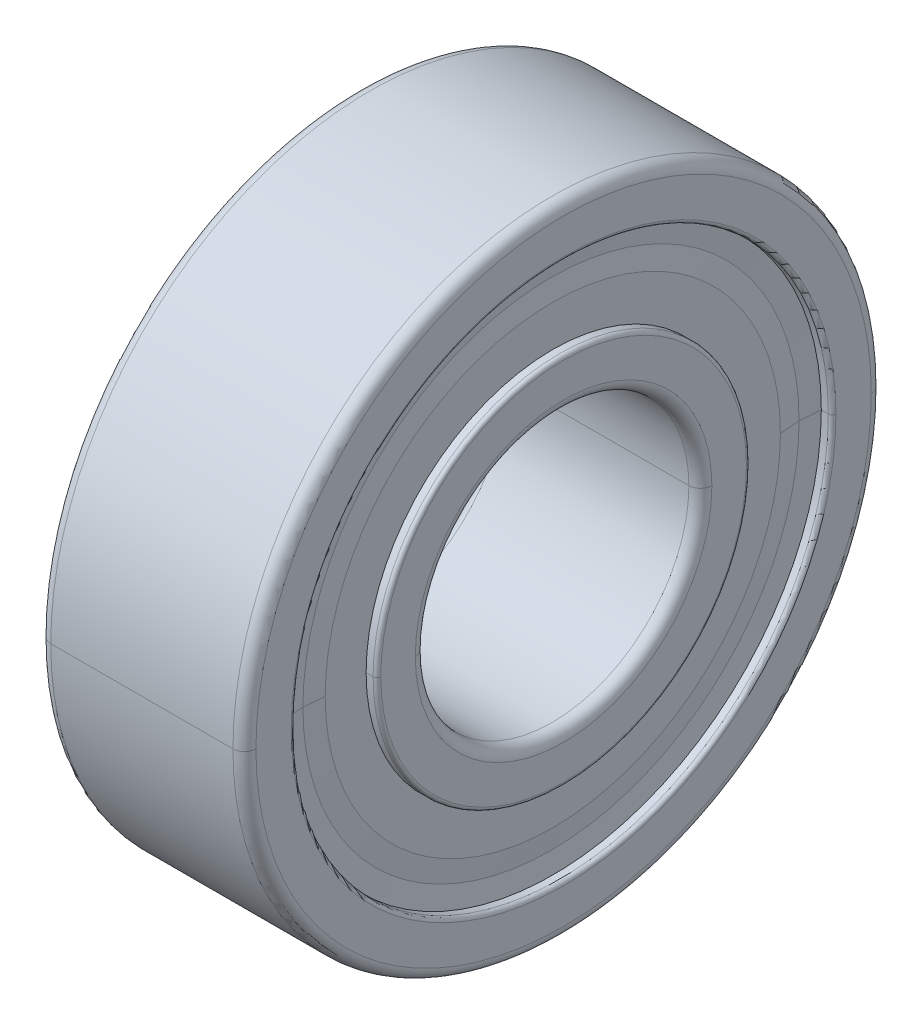
ISO-10303-21;
HEADER;
FILE_DESCRIPTION(('STEP AP214'),'2;1');
FILE_NAME('part.step','',(''),(''),'','','');
FILE_SCHEMA(('AUTOMOTIVE_DESIGN { 1 0 10303 214 1 1 1 1 }'));
ENDSEC;
DATA;
#1=APPLICATION_CONTEXT('core data for automotive mechanical design processes');
#2=APPLICATION_PROTOCOL_DEFINITION('international standard','automotive_design',2000,#1);
#3=PRODUCT_CONTEXT('',#1,'mechanical');
#4=PRODUCT('Part','Part','',(#3));
#5=PRODUCT_RELATED_PRODUCT_CATEGORY('part','',(#4));
#6=PRODUCT_DEFINITION_FORMATION('','',#4);
#7=PRODUCT_DEFINITION_CONTEXT('part definition',#1,'design');
#8=PRODUCT_DEFINITION('design','',#6,#7);
#9=PRODUCT_DEFINITION_SHAPE('','',#8);
#10=(LENGTH_UNIT() NAMED_UNIT(*) SI_UNIT(.MILLI.,.METRE.));
#11=(NAMED_UNIT(*) PLANE_ANGLE_UNIT() SI_UNIT($,.RADIAN.));
#12=(NAMED_UNIT(*) SI_UNIT($,.STERADIAN.) SOLID_ANGLE_UNIT());
#13=UNCERTAINTY_MEASURE_WITH_UNIT(LENGTH_MEASURE(1.E-05),#10,'distance_accuracy_value','');
#14=(GEOMETRIC_REPRESENTATION_CONTEXT(3) GLOBAL_UNCERTAINTY_ASSIGNED_CONTEXT((#13)) GLOBAL_UNIT_ASSIGNED_CONTEXT((#10,
#11,#12)) REPRESENTATION_CONTEXT('',''));
#15=CARTESIAN_POINT('',(0.,0.,0.));
#16=DIRECTION('',(0.,0.,1.));
#17=DIRECTION('',(1.,0.,0.));
#18=AXIS2_PLACEMENT_3D('',#15,#16,#17);
#19=CARTESIAN_POINT('',(-14.5369143589278,0.,0.));
#20=DIRECTION('',(-1.,0.,0.));
#21=DIRECTION('',(0.,0.,1.));
#22=AXIS2_PLACEMENT_3D('',#19,#20,#21);
#23=CYLINDRICAL_SURFACE('',#22,4.763);
#24=DIRECTION('',(-1.,0.,0.));
#25=VECTOR('',#24,1.);
#26=CARTESIAN_POINT('',(-14.5369143589278,0.,-4.763));
#27=LINE('',#26,#25);
#28=CARTESIAN_POINT('',(6.744,0.,-4.763));
#29=VERTEX_POINT('',#28);
#30=CARTESIAN_POINT('',(0.4,0.,-4.763));
#31=VERTEX_POINT('',#30);
#32=EDGE_CURVE('E257',#29,#31,#27,.T.);
#33=ORIENTED_EDGE('',*,*,#32,.F.);
#34=CARTESIAN_POINT('',(6.744,0.,0.));
#35=DIRECTION('',(-1.,0.,0.));
#36=DIRECTION('',(0.,0.,1.));
#37=AXIS2_PLACEMENT_3D('',#34,#35,#36);
#38=CIRCLE('',#37,4.763);
#39=CARTESIAN_POINT('',(6.744,0.,4.763));
#40=VERTEX_POINT('',#39);
#41=EDGE_CURVE('E244',#40,#29,#38,.T.);
#42=ORIENTED_EDGE('',*,*,#41,.F.);
#43=DIRECTION('',(-1.,0.,0.));
#44=VECTOR('',#43,1.);
#45=CARTESIAN_POINT('',(-14.5369143589278,0.,4.763));
#46=LINE('',#45,#44);
#47=CARTESIAN_POINT('',(0.4,0.,4.763));
#48=VERTEX_POINT('',#47);
#49=EDGE_CURVE('E254',#40,#48,#46,.T.);
#50=ORIENTED_EDGE('',*,*,#49,.T.);
#51=CARTESIAN_POINT('',(0.4,0.,0.));
#52=DIRECTION('',(-1.,0.,0.));
#53=DIRECTION('',(0.,0.,1.));
#54=AXIS2_PLACEMENT_3D('',#51,#52,#53);
#55=CIRCLE('',#54,4.763);
#56=EDGE_CURVE('E259',#48,#31,#55,.T.);
#57=ORIENTED_EDGE('',*,*,#56,.T.);
#58=EDGE_LOOP('',(#33,#42,#50,#57));
#59=FACE_BOUND('',#58,.T.);
#60=ADVANCED_FACE('F15',(#59),#23,.F.);
#61=CARTESIAN_POINT('',(6.744,0.,0.));
#62=DIRECTION('',(-1.,0.,0.));
#63=DIRECTION('',(0.,0.,1.));
#64=AXIS2_PLACEMENT_3D('',#61,#62,#63);
#65=TOROIDAL_SURFACE('',#64,5.16300000000007,0.400000000000066);
#66=CARTESIAN_POINT('',(6.744,0.,-5.16300000000007));
#67=DIRECTION('',(0.,1.,0.));
#68=DIRECTION('',(0.,0.,1.));
#69=AXIS2_PLACEMENT_3D('',#66,#67,#68);
#70=CIRCLE('',#69,0.400000000000066);
#71=CARTESIAN_POINT('',(7.144,0.,-5.163));
#72=VERTEX_POINT('',#71);
#73=EDGE_CURVE('E233',#29,#72,#70,.T.);
#74=ORIENTED_EDGE('',*,*,#73,.F.);
#75=CARTESIAN_POINT('',(6.744,0.,0.));
#76=DIRECTION('',(-1.,0.,0.));
#77=DIRECTION('',(0.,0.,1.));
#78=AXIS2_PLACEMENT_3D('',#75,#76,#77);
#79=CIRCLE('',#78,4.763);
#80=EDGE_CURVE('E238',#29,#40,#79,.T.);
#81=ORIENTED_EDGE('',*,*,#80,.T.);
#82=CARTESIAN_POINT('',(6.744,0.,5.16300000000007));
#83=DIRECTION('',(0.,-1.,0.));
#84=DIRECTION('',(0.,0.,-1.));
#85=AXIS2_PLACEMENT_3D('',#82,#83,#84);
#86=CIRCLE('',#85,0.400000000000066);
#87=CARTESIAN_POINT('',(7.144,0.,5.163));
#88=VERTEX_POINT('',#87);
#89=EDGE_CURVE('E249',#40,#88,#86,.T.);
#90=ORIENTED_EDGE('',*,*,#89,.T.);
#91=CARTESIAN_POINT('',(7.144,0.,0.));
#92=DIRECTION('',(-1.,0.,0.));
#93=DIRECTION('',(0.,0.,1.));
#94=AXIS2_PLACEMENT_3D('',#91,#92,#93);
#95=CIRCLE('',#94,5.163);
#96=EDGE_CURVE('E10',#72,#88,#95,.T.);
#97=ORIENTED_EDGE('',*,*,#96,.F.);
#98=EDGE_LOOP('',(#74,#81,#90,#97));
#99=FACE_BOUND('',#98,.T.);
#100=ADVANCED_FACE('F235',(#99),#65,.T.);
#101=CARTESIAN_POINT('',(7.144,-6.367,0.));
#102=DIRECTION('',(1.,0.,0.));
#103=DIRECTION('',(0.,1.,0.));
#104=AXIS2_PLACEMENT_3D('',#101,#102,#103);
#105=PLANE('',#104);
#106=CARTESIAN_POINT('',(7.144,0.,0.));
#107=DIRECTION('',(-1.,0.,0.));
#108=DIRECTION('',(0.,0.,1.));
#109=AXIS2_PLACEMENT_3D('',#106,#107,#108);
#110=CIRCLE('',#109,5.163);
#111=EDGE_CURVE('E243',#88,#72,#110,.T.);
#112=ORIENTED_EDGE('',*,*,#111,.T.);
#113=ORIENTED_EDGE('',*,*,#96,.T.);
#114=EDGE_LOOP('',(#112,#113));
#115=FACE_BOUND('',#114,.T.);
#116=CARTESIAN_POINT('',(7.144,0.,0.));
#117=DIRECTION('',(-1.,0.,0.));
#118=DIRECTION('',(0.,0.,1.));
#119=AXIS2_PLACEMENT_3D('',#116,#117,#118);
#120=CIRCLE('',#119,6.367);
#121=CARTESIAN_POINT('',(7.144,0.,6.367));
#122=VERTEX_POINT('',#121);
#123=CARTESIAN_POINT('',(7.144,0.,-6.367));
#124=VERTEX_POINT('',#123);
#125=EDGE_CURVE('E393',#122,#124,#120,.T.);
#126=ORIENTED_EDGE('',*,*,#125,.F.);
#127=CARTESIAN_POINT('',(7.144,0.,0.));
#128=DIRECTION('',(-1.,0.,0.));
#129=DIRECTION('',(0.,0.,1.));
#130=AXIS2_PLACEMENT_3D('',#127,#128,#129);
#131=CIRCLE('',#130,6.367);
#132=EDGE_CURVE('E26',#124,#122,#131,.T.);
#133=ORIENTED_EDGE('',*,*,#132,.F.);
#134=EDGE_LOOP('',(#126,#133));
#135=FACE_BOUND('',#134,.T.);
#136=ADVANCED_FACE('F840',(#115,#135),#105,.T.);
#137=CARTESIAN_POINT('',(7.011,0.,0.));
#138=DIRECTION('',(-1.,0.,0.));
#139=DIRECTION('',(0.,0.,1.));
#140=AXIS2_PLACEMENT_3D('',#137,#138,#139);
#141=TOROIDAL_SURFACE('',#140,6.367,0.133000000000035);
#142=CARTESIAN_POINT('',(7.011,0.,-6.367));
#143=DIRECTION('',(0.,1.,0.));
#144=DIRECTION('',(0.,0.,1.));
#145=AXIS2_PLACEMENT_3D('',#142,#143,#144);
#146=CIRCLE('',#145,0.133000000000036);
#147=CARTESIAN_POINT('',(7.011,0.,-6.5));
#148=VERTEX_POINT('',#147);
#149=EDGE_CURVE('E397',#124,#148,#146,.T.);
#150=ORIENTED_EDGE('',*,*,#149,.F.);
#151=ORIENTED_EDGE('',*,*,#132,.T.);
#152=CARTESIAN_POINT('',(7.011,0.,6.367));
#153=DIRECTION('',(0.,-1.,0.));
#154=DIRECTION('',(0.,0.,-1.));
#155=AXIS2_PLACEMENT_3D('',#152,#153,#154);
#156=CIRCLE('',#155,0.133000000000036);
#157=CARTESIAN_POINT('',(7.011,0.,6.5));
#158=VERTEX_POINT('',#157);
#159=EDGE_CURVE('E489',#122,#158,#156,.T.);
#160=ORIENTED_EDGE('',*,*,#159,.T.);
#161=CARTESIAN_POINT('',(7.011,0.,0.));
#162=DIRECTION('',(-1.,0.,0.));
#163=DIRECTION('',(0.,0.,1.));
#164=AXIS2_PLACEMENT_3D('',#161,#162,#163);
#165=CIRCLE('',#164,6.5);
#166=EDGE_CURVE('E441',#148,#158,#165,.T.);
#167=ORIENTED_EDGE('',*,*,#166,.F.);
#168=EDGE_LOOP('',(#150,#151,#160,#167));
#169=FACE_BOUND('',#168,.T.);
#170=ADVANCED_FACE('F756',(#169),#141,.T.);
#171=CARTESIAN_POINT('',(-14.5369143589278,0.,0.));
#172=DIRECTION('',(-1.,0.,0.));
#173=DIRECTION('',(0.,0.,1.));
#174=AXIS2_PLACEMENT_3D('',#171,#172,#173);
#175=CYLINDRICAL_SURFACE('',#174,6.5);
#176=DIRECTION('',(-1.,0.,0.));
#177=VECTOR('',#176,1.);
#178=CARTESIAN_POINT('',(-14.5369143589278,0.,-6.5));
#179=LINE('',#178,#177);
#180=CARTESIAN_POINT('',(6.768,0.,-6.5));
#181=VERTEX_POINT('',#180);
#182=EDGE_CURVE('E291',#148,#181,#179,.T.);
#183=ORIENTED_EDGE('',*,*,#182,.F.);
#184=ORIENTED_EDGE('',*,*,#166,.T.);
#185=DIRECTION('',(-1.,0.,0.));
#186=VECTOR('',#185,1.);
#187=CARTESIAN_POINT('',(-14.5369143589278,0.,6.5));
#188=LINE('',#187,#186);
#189=CARTESIAN_POINT('',(6.768,0.,6.5));
#190=VERTEX_POINT('',#189);
#191=EDGE_CURVE('E290',#158,#190,#188,.T.);
#192=ORIENTED_EDGE('',*,*,#191,.T.);
#193=CARTESIAN_POINT('',(6.768,0.,0.));
#194=DIRECTION('',(-1.,0.,0.));
#195=DIRECTION('',(0.,0.,1.));
#196=AXIS2_PLACEMENT_3D('',#193,#194,#195);
#197=CIRCLE('',#196,6.5);
#198=EDGE_CURVE('E466',#181,#190,#197,.T.);
#199=ORIENTED_EDGE('',*,*,#198,.F.);
#200=EDGE_LOOP('',(#183,#184,#192,#199));
#201=FACE_BOUND('',#200,.T.);
#202=ADVANCED_FACE('F726',(#201),#175,.T.);
#203=CARTESIAN_POINT('',(6.768,-7.925,0.));
#204=DIRECTION('',(1.,0.,0.));
#205=DIRECTION('',(0.,1.,0.));
#206=AXIS2_PLACEMENT_3D('',#203,#204,#205);
#207=PLANE('',#206);
#208=CARTESIAN_POINT('',(6.768,0.,0.));
#209=DIRECTION('',(-1.,0.,0.));
#210=DIRECTION('',(0.,0.,1.));
#211=AXIS2_PLACEMENT_3D('',#208,#209,#210);
#212=CIRCLE('',#211,6.5);
#213=EDGE_CURVE('E286',#190,#181,#212,.T.);
#214=ORIENTED_EDGE('',*,*,#213,.T.);
#215=ORIENTED_EDGE('',*,*,#198,.T.);
#216=EDGE_LOOP('',(#214,#215));
#217=FACE_BOUND('',#216,.T.);
#218=CARTESIAN_POINT('',(6.768,0.,0.));
#219=DIRECTION('',(-1.,0.,0.));
#220=DIRECTION('',(0.,0.,1.));
#221=AXIS2_PLACEMENT_3D('',#218,#219,#220);
#222=CIRCLE('',#221,7.925);
#223=CARTESIAN_POINT('',(6.768,0.,7.925));
#224=VERTEX_POINT('',#223);
#225=CARTESIAN_POINT('',(6.768,0.,-7.925));
#226=VERTEX_POINT('',#225);
#227=EDGE_CURVE('E325',#224,#226,#222,.T.);
#228=ORIENTED_EDGE('',*,*,#227,.F.);
#229=CARTESIAN_POINT('',(6.768,0.,0.));
#230=DIRECTION('',(-1.,0.,0.));
#231=DIRECTION('',(0.,0.,1.));
#232=AXIS2_PLACEMENT_3D('',#229,#230,#231);
#233=CIRCLE('',#232,7.925);
#234=EDGE_CURVE('E19',#226,#224,#233,.T.);
#235=ORIENTED_EDGE('',*,*,#234,.F.);
#236=EDGE_LOOP('',(#228,#235));
#237=FACE_BOUND('',#236,.T.);
#238=ADVANCED_FACE('F721',(#217,#237),#207,.T.);
#239=CARTESIAN_POINT('',(6.70525,0.,0.));
#240=DIRECTION('',(-1.,0.,0.));
#241=DIRECTION('',(0.,0.,1.));
#242=AXIS2_PLACEMENT_3D('',#239,#240,#241);
#243=CONICAL_SURFACE('',#242,8.6375,1.48295279871847);
#244=DIRECTION('',(-0.0877305977724769,0.,-0.996144237655614));
#245=VECTOR('',#244,1.);
#246=CARTESIAN_POINT('',(6.70525,0.,-8.6375));
#247=LINE('',#246,#245);
#248=CARTESIAN_POINT('',(6.70525,0.,-8.6375));
#249=VERTEX_POINT('',#248);
#250=EDGE_CURVE('E329',#226,#249,#247,.T.);
#251=ORIENTED_EDGE('',*,*,#250,.F.);
#252=ORIENTED_EDGE('',*,*,#234,.T.);
#253=DIRECTION('',(-0.0877305977724769,0.,0.996144237655614));
#254=VECTOR('',#253,1.);
#255=CARTESIAN_POINT('',(6.70525,0.,8.6375));
#256=LINE('',#255,#254);
#257=CARTESIAN_POINT('',(6.70525,0.,8.6375));
#258=VERTEX_POINT('',#257);
#259=EDGE_CURVE('E308',#224,#258,#256,.T.);
#260=ORIENTED_EDGE('',*,*,#259,.T.);
#261=CARTESIAN_POINT('',(6.70525,0.,0.));
#262=DIRECTION('',(-1.,0.,0.));
#263=DIRECTION('',(0.,0.,1.));
#264=AXIS2_PLACEMENT_3D('',#261,#262,#263);
#265=CIRCLE('',#264,8.6375);
#266=EDGE_CURVE('E312',#249,#258,#265,.T.);
#267=ORIENTED_EDGE('',*,*,#266,.F.);
#268=EDGE_LOOP('',(#251,#252,#260,#267));
#269=FACE_BOUND('',#268,.T.);
#270=ADVANCED_FACE('F725',(#269),#243,.T.);
#271=CARTESIAN_POINT('',(6.768,0.,0.));
#272=DIRECTION('',(1.,0.,0.));
#273=DIRECTION('',(0.,0.,-1.));
#274=AXIS2_PLACEMENT_3D('',#271,#272,#273);
#275=CONICAL_SURFACE('',#274,9.35,1.48295279871847);
#276=DIRECTION('',(0.0877305977724773,0.,0.996144237655614));
#277=VECTOR('',#276,1.);
#278=CARTESIAN_POINT('',(6.768,0.,9.35));
#279=LINE('',#278,#277);
#280=CARTESIAN_POINT('',(6.768,0.,9.35));
#281=VERTEX_POINT('',#280);
#282=EDGE_CURVE('E374',#258,#281,#279,.T.);
#283=ORIENTED_EDGE('',*,*,#282,.F.);
#284=CARTESIAN_POINT('',(6.70525,0.,0.));
#285=DIRECTION('',(-1.,0.,0.));
#286=DIRECTION('',(0.,0.,1.));
#287=AXIS2_PLACEMENT_3D('',#284,#285,#286);
#288=CIRCLE('',#287,8.6375);
#289=EDGE_CURVE('E313',#258,#249,#288,.T.);
#290=ORIENTED_EDGE('',*,*,#289,.T.);
#291=DIRECTION('',(0.0877305977724773,0.,-0.996144237655614));
#292=VECTOR('',#291,1.);
#293=CARTESIAN_POINT('',(6.768,0.,-9.35));
#294=LINE('',#293,#292);
#295=CARTESIAN_POINT('',(6.768,0.,-9.35));
#296=VERTEX_POINT('',#295);
#297=EDGE_CURVE('E373',#249,#296,#294,.T.);
#298=ORIENTED_EDGE('',*,*,#297,.T.);
#299=CARTESIAN_POINT('',(6.768,0.,0.));
#300=DIRECTION('',(-1.,0.,0.));
#301=DIRECTION('',(0.,0.,1.));
#302=AXIS2_PLACEMENT_3D('',#299,#300,#301);
#303=CIRCLE('',#302,9.35);
#304=EDGE_CURVE('E423',#281,#296,#303,.T.);
#305=ORIENTED_EDGE('',*,*,#304,.F.);
#306=EDGE_LOOP('',(#283,#290,#298,#305));
#307=FACE_BOUND('',#306,.T.);
#308=ADVANCED_FACE('F696',(#307),#275,.F.);
#309=CARTESIAN_POINT('',(-14.5369143589278,0.,0.));
#310=DIRECTION('',(-1.,0.,0.));
#311=DIRECTION('',(0.,0.,1.));
#312=AXIS2_PLACEMENT_3D('',#309,#310,#311);
#313=CYLINDRICAL_SURFACE('',#312,9.35);
#314=DIRECTION('',(-1.,0.,0.));
#315=VECTOR('',#314,1.);
#316=CARTESIAN_POINT('',(-14.5369143589278,0.,-9.35));
#317=LINE('',#316,#315);
#318=CARTESIAN_POINT('',(7.011,0.,-9.35));
#319=VERTEX_POINT('',#318);
#320=EDGE_CURVE('E307',#319,#296,#317,.T.);
#321=ORIENTED_EDGE('',*,*,#320,.F.);
#322=CARTESIAN_POINT('',(7.011,0.,0.));
#323=DIRECTION('',(-1.,0.,0.));
#324=DIRECTION('',(0.,0.,1.));
#325=AXIS2_PLACEMENT_3D('',#322,#323,#324);
#326=CIRCLE('',#325,9.35);
#327=CARTESIAN_POINT('',(7.011,0.,9.35));
#328=VERTEX_POINT('',#327);
#329=EDGE_CURVE('E306',#328,#319,#326,.T.);
#330=ORIENTED_EDGE('',*,*,#329,.F.);
#331=DIRECTION('',(-1.,0.,0.));
#332=VECTOR('',#331,1.);
#333=CARTESIAN_POINT('',(-14.5369143589278,0.,9.35));
#334=LINE('',#333,#332);
#335=EDGE_CURVE('E302',#328,#281,#334,.T.);
#336=ORIENTED_EDGE('',*,*,#335,.T.);
#337=ORIENTED_EDGE('',*,*,#304,.T.);
#338=EDGE_LOOP('',(#321,#330,#336,#337));
#339=FACE_BOUND('',#338,.T.);
#340=ADVANCED_FACE('F691',(#339),#313,.F.);
#341=CARTESIAN_POINT('',(7.011,0.,0.));
#342=DIRECTION('',(-1.,0.,0.));
#343=DIRECTION('',(0.,0.,1.));
#344=AXIS2_PLACEMENT_3D('',#341,#342,#343);
#345=TOROIDAL_SURFACE('',#344,9.483,0.133000000000035);
#346=CARTESIAN_POINT('',(7.011,0.,-9.483));
#347=DIRECTION('',(0.,1.,0.));
#348=DIRECTION('',(0.,0.,1.));
#349=AXIS2_PLACEMENT_3D('',#346,#347,#348);
#350=CIRCLE('',#349,0.133000000000036);
#351=CARTESIAN_POINT('',(7.144,0.,-9.483));
#352=VERTEX_POINT('',#351);
#353=EDGE_CURVE('E385',#319,#352,#350,.T.);
#354=ORIENTED_EDGE('',*,*,#353,.F.);
#355=CARTESIAN_POINT('',(7.011,0.,0.));
#356=DIRECTION('',(-1.,0.,0.));
#357=DIRECTION('',(0.,0.,1.));
#358=AXIS2_PLACEMENT_3D('',#355,#356,#357);
#359=CIRCLE('',#358,9.35);
#360=EDGE_CURVE('E442',#319,#328,#359,.T.);
#361=ORIENTED_EDGE('',*,*,#360,.T.);
#362=CARTESIAN_POINT('',(7.011,0.,9.483));
#363=DIRECTION('',(0.,-1.,0.));
#364=DIRECTION('',(0.,0.,-1.));
#365=AXIS2_PLACEMENT_3D('',#362,#363,#364);
#366=CIRCLE('',#365,0.133000000000036);
#367=CARTESIAN_POINT('',(7.144,0.,9.483));
#368=VERTEX_POINT('',#367);
#369=EDGE_CURVE('E342',#328,#368,#366,.T.);
#370=ORIENTED_EDGE('',*,*,#369,.T.);
#371=CARTESIAN_POINT('',(7.144,0.,0.));
#372=DIRECTION('',(-1.,0.,0.));
#373=DIRECTION('',(0.,0.,1.));
#374=AXIS2_PLACEMENT_3D('',#371,#372,#373);
#375=CIRCLE('',#374,9.483);
#376=EDGE_CURVE('E294',#352,#368,#375,.T.);
#377=ORIENTED_EDGE('',*,*,#376,.F.);
#378=EDGE_LOOP('',(#354,#361,#370,#377));
#379=FACE_BOUND('',#378,.T.);
#380=ADVANCED_FACE('F695',(#379),#345,.T.);
#381=CARTESIAN_POINT('',(7.144,-10.713,0.));
#382=DIRECTION('',(1.,0.,0.));
#383=DIRECTION('',(0.,1.,0.));
#384=AXIS2_PLACEMENT_3D('',#381,#382,#383);
#385=PLANE('',#384);
#386=CARTESIAN_POINT('',(7.144,0.,0.));
#387=DIRECTION('',(-1.,0.,0.));
#388=DIRECTION('',(0.,0.,1.));
#389=AXIS2_PLACEMENT_3D('',#386,#387,#388);
#390=CIRCLE('',#389,9.483);
#391=EDGE_CURVE('E449',#368,#352,#390,.T.);
#392=ORIENTED_EDGE('',*,*,#391,.T.);
#393=ORIENTED_EDGE('',*,*,#376,.T.);
#394=EDGE_LOOP('',(#392,#393));
#395=FACE_BOUND('',#394,.T.);
#396=CARTESIAN_POINT('',(7.144,0.,0.));
#397=DIRECTION('',(-1.,0.,0.));
#398=DIRECTION('',(0.,0.,1.));
#399=AXIS2_PLACEMENT_3D('',#396,#397,#398);
#400=CIRCLE('',#399,10.713);
#401=CARTESIAN_POINT('',(7.144,0.,10.713));
#402=VERTEX_POINT('',#401);
#403=CARTESIAN_POINT('',(7.144,0.,-10.713));
#404=VERTEX_POINT('',#403);
#405=EDGE_CURVE('E338',#402,#404,#400,.T.);
#406=ORIENTED_EDGE('',*,*,#405,.F.);
#407=CARTESIAN_POINT('',(7.144,0.,0.));
#408=DIRECTION('',(-1.,0.,0.));
#409=DIRECTION('',(0.,0.,1.));
#410=AXIS2_PLACEMENT_3D('',#407,#408,#409);
#411=CIRCLE('',#410,10.713);
#412=EDGE_CURVE('E183',#404,#402,#411,.T.);
#413=ORIENTED_EDGE('',*,*,#412,.F.);
#414=EDGE_LOOP('',(#406,#413));
#415=FACE_BOUND('',#414,.T.);
#416=ADVANCED_FACE('F767',(#395,#415),#385,.T.);
#417=CARTESIAN_POINT('',(6.74400000000062,0.,0.));
#418=DIRECTION('',(-1.,0.,0.));
#419=DIRECTION('',(0.,0.,1.));
#420=AXIS2_PLACEMENT_3D('',#417,#418,#419);
#421=TOROIDAL_SURFACE('',#420,10.7130000000006,0.399999999999382);
#422=CARTESIAN_POINT('',(6.74400000000062,0.,-10.7130000000006));
#423=DIRECTION('',(0.,1.,0.));
#424=DIRECTION('',(0.,0.,1.));
#425=AXIS2_PLACEMENT_3D('',#422,#423,#424);
#426=CIRCLE('',#425,0.399999999999382);
#427=CARTESIAN_POINT('',(6.744,0.,-11.113));
#428=VERTEX_POINT('',#427);
#429=EDGE_CURVE('E341',#404,#428,#426,.T.);
#430=ORIENTED_EDGE('',*,*,#429,.F.);
#431=ORIENTED_EDGE('',*,*,#412,.T.);
#432=CARTESIAN_POINT('',(6.74400000000062,0.,10.7130000000006));
#433=DIRECTION('',(0.,-1.,0.));
#434=DIRECTION('',(0.,0.,-1.));
#435=AXIS2_PLACEMENT_3D('',#432,#433,#434);
#436=CIRCLE('',#435,0.399999999999382);
#437=CARTESIAN_POINT('',(6.744,0.,11.113));
#438=VERTEX_POINT('',#437);
#439=EDGE_CURVE('E417',#402,#438,#436,.T.);
#440=ORIENTED_EDGE('',*,*,#439,.T.);
#441=CARTESIAN_POINT('',(6.744,0.,0.));
#442=DIRECTION('',(-1.,0.,0.));
#443=DIRECTION('',(0.,0.,1.));
#444=AXIS2_PLACEMENT_3D('',#441,#442,#443);
#445=CIRCLE('',#444,11.113);
#446=EDGE_CURVE('E295',#428,#438,#445,.T.);
#447=ORIENTED_EDGE('',*,*,#446,.F.);
#448=EDGE_LOOP('',(#430,#431,#440,#447));
#449=FACE_BOUND('',#448,.T.);
#450=ADVANCED_FACE('F762',(#449),#421,.T.);
#451=CARTESIAN_POINT('',(-14.5369143589278,0.,0.));
#452=DIRECTION('',(-1.,0.,0.));
#453=DIRECTION('',(0.,0.,1.));
#454=AXIS2_PLACEMENT_3D('',#451,#452,#453);
#455=CYLINDRICAL_SURFACE('',#454,11.113);
#456=DIRECTION('',(-1.,0.,0.));
#457=VECTOR('',#456,1.);
#458=CARTESIAN_POINT('',(-14.5369143589278,0.,-11.113));
#459=LINE('',#458,#457);
#460=CARTESIAN_POINT('',(0.4,0.,-11.113));
#461=VERTEX_POINT('',#460);
#462=EDGE_CURVE('E420',#428,#461,#459,.T.);
#463=ORIENTED_EDGE('',*,*,#462,.F.);
#464=ORIENTED_EDGE('',*,*,#446,.T.);
#465=DIRECTION('',(-1.,0.,0.));
#466=VECTOR('',#465,1.);
#467=CARTESIAN_POINT('',(-14.5369143589278,0.,11.113));
#468=LINE('',#467,#466);
#469=CARTESIAN_POINT('',(0.4,0.,11.113));
#470=VERTEX_POINT('',#469);
#471=EDGE_CURVE('E358',#438,#470,#468,.T.);
#472=ORIENTED_EDGE('',*,*,#471,.T.);
#473=CARTESIAN_POINT('',(0.4,0.,0.));
#474=DIRECTION('',(-1.,0.,0.));
#475=DIRECTION('',(0.,0.,1.));
#476=AXIS2_PLACEMENT_3D('',#473,#474,#475);
#477=CIRCLE('',#476,11.113);
#478=EDGE_CURVE('E411',#461,#470,#477,.T.);
#479=ORIENTED_EDGE('',*,*,#478,.F.);
#480=EDGE_LOOP('',(#463,#464,#472,#479));
#481=FACE_BOUND('',#480,.T.);
#482=ADVANCED_FACE('F766',(#481),#455,.T.);
#483=CARTESIAN_POINT('',(0.399999999999349,0.,0.));
#484=DIRECTION('',(-1.,0.,0.));
#485=DIRECTION('',(0.,0.,1.));
#486=AXIS2_PLACEMENT_3D('',#483,#484,#485);
#487=TOROIDAL_SURFACE('',#486,10.7130000000006,0.399999999999348);
#488=CARTESIAN_POINT('',(0.399999999999349,0.,-10.7130000000006));
#489=DIRECTION('',(0.,1.,0.));
#490=DIRECTION('',(0.,0.,1.));
#491=AXIS2_PLACEMENT_3D('',#488,#489,#490);
#492=CIRCLE('',#491,0.399999999999349);
#493=CARTESIAN_POINT('',(0.,0.,-10.713));
#494=VERTEX_POINT('',#493);
#495=EDGE_CURVE('E347',#461,#494,#492,.T.);
#496=ORIENTED_EDGE('',*,*,#495,.F.);
#497=ORIENTED_EDGE('',*,*,#478,.T.);
#498=CARTESIAN_POINT('',(0.399999999999349,0.,10.7130000000006));
#499=DIRECTION('',(0.,-1.,0.));
#500=DIRECTION('',(0.,0.,-1.));
#501=AXIS2_PLACEMENT_3D('',#498,#499,#500);
#502=CIRCLE('',#501,0.399999999999349);
#503=CARTESIAN_POINT('',(0.,0.,10.713));
#504=VERTEX_POINT('',#503);
#505=EDGE_CURVE('E346',#470,#504,#502,.T.);
#506=ORIENTED_EDGE('',*,*,#505,.T.);
#507=CARTESIAN_POINT('',(0.,0.,0.));
#508=DIRECTION('',(-1.,0.,0.));
#509=DIRECTION('',(0.,0.,1.));
#510=AXIS2_PLACEMENT_3D('',#507,#508,#509);
#511=CIRCLE('',#510,10.713);
#512=EDGE_CURVE('E414',#494,#504,#511,.T.);
#513=ORIENTED_EDGE('',*,*,#512,.F.);
#514=EDGE_LOOP('',(#496,#497,#506,#513));
#515=FACE_BOUND('',#514,.T.);
#516=ADVANCED_FACE('F936',(#515),#487,.T.);
#517=CARTESIAN_POINT('',(0.,-9.483,0.));
#518=DIRECTION('',(-1.,0.,0.));
#519=DIRECTION('',(0.,0.,1.));
#520=AXIS2_PLACEMENT_3D('',#517,#518,#519);
#521=PLANE('',#520);
#522=CARTESIAN_POINT('',(0.,0.,0.));
#523=DIRECTION('',(-1.,0.,0.));
#524=DIRECTION('',(0.,0.,1.));
#525=AXIS2_PLACEMENT_3D('',#522,#523,#524);
#526=CIRCLE('',#525,9.483);
#527=CARTESIAN_POINT('',(0.,0.,9.483));
#528=VERTEX_POINT('',#527);
#529=CARTESIAN_POINT('',(0.,0.,-9.483));
#530=VERTEX_POINT('',#529);
#531=EDGE_CURVE('E356',#528,#530,#526,.T.);
#532=ORIENTED_EDGE('',*,*,#531,.F.);
#533=CARTESIAN_POINT('',(0.,0.,0.));
#534=DIRECTION('',(-1.,0.,0.));
#535=DIRECTION('',(0.,0.,1.));
#536=AXIS2_PLACEMENT_3D('',#533,#534,#535);
#537=CIRCLE('',#536,9.483);
#538=EDGE_CURVE('E428',#530,#528,#537,.T.);
#539=ORIENTED_EDGE('',*,*,#538,.F.);
#540=EDGE_LOOP('',(#532,#539));
#541=FACE_BOUND('',#540,.T.);
#542=CARTESIAN_POINT('',(0.,0.,0.));
#543=DIRECTION('',(-1.,0.,0.));
#544=DIRECTION('',(0.,0.,1.));
#545=AXIS2_PLACEMENT_3D('',#542,#543,#544);
#546=CIRCLE('',#545,10.713);
#547=EDGE_CURVE('E343',#504,#494,#546,.T.);
#548=ORIENTED_EDGE('',*,*,#547,.T.);
#549=ORIENTED_EDGE('',*,*,#512,.T.);
#550=EDGE_LOOP('',(#548,#549));
#551=FACE_BOUND('',#550,.T.);
#552=ADVANCED_FACE('F940',(#541,#551),#521,.T.);
#553=CARTESIAN_POINT('',(0.133000000000018,0.,0.));
#554=DIRECTION('',(-1.,0.,0.));
#555=DIRECTION('',(0.,0.,1.));
#556=AXIS2_PLACEMENT_3D('',#553,#554,#555);
#557=TOROIDAL_SURFACE('',#556,9.483,0.133000000000017);
#558=CARTESIAN_POINT('',(0.133000000000018,0.,-9.483));
#559=DIRECTION('',(0.,1.,0.));
#560=DIRECTION('',(0.,0.,1.));
#561=AXIS2_PLACEMENT_3D('',#558,#559,#560);
#562=CIRCLE('',#561,0.133000000000017);
#563=CARTESIAN_POINT('',(0.133,0.,-9.35));
#564=VERTEX_POINT('',#563);
#565=EDGE_CURVE('E478',#530,#564,#562,.T.);
#566=ORIENTED_EDGE('',*,*,#565,.F.);
#567=ORIENTED_EDGE('',*,*,#538,.T.);
#568=CARTESIAN_POINT('',(0.133000000000018,0.,9.483));
#569=DIRECTION('',(0.,-1.,0.));
#570=DIRECTION('',(0.,0.,-1.));
#571=AXIS2_PLACEMENT_3D('',#568,#569,#570);
#572=CIRCLE('',#571,0.133000000000017);
#573=CARTESIAN_POINT('',(0.133,0.,9.35));
#574=VERTEX_POINT('',#573);
#575=EDGE_CURVE('E450',#528,#574,#572,.T.);
#576=ORIENTED_EDGE('',*,*,#575,.T.);
#577=CARTESIAN_POINT('',(0.133,0.,0.));
#578=DIRECTION('',(-1.,0.,0.));
#579=DIRECTION('',(0.,0.,1.));
#580=AXIS2_PLACEMENT_3D('',#577,#578,#579);
#581=CIRCLE('',#580,9.35);
#582=EDGE_CURVE('E402',#564,#574,#581,.T.);
#583=ORIENTED_EDGE('',*,*,#582,.F.);
#584=EDGE_LOOP('',(#566,#567,#576,#583));
#585=FACE_BOUND('',#584,.T.);
#586=ADVANCED_FACE('F946',(#585),#557,.T.);
#587=CARTESIAN_POINT('',(-14.5369143589278,0.,0.));
#588=DIRECTION('',(-1.,0.,0.));
#589=DIRECTION('',(0.,0.,1.));
#590=AXIS2_PLACEMENT_3D('',#587,#588,#589);
#591=CYLINDRICAL_SURFACE('',#590,9.35);
#592=DIRECTION('',(-1.,0.,0.));
#593=VECTOR('',#592,1.);
#594=CARTESIAN_POINT('',(-14.5369143589278,0.,-9.35));
#595=LINE('',#594,#593);
#596=CARTESIAN_POINT('',(0.376,0.,-9.35));
#597=VERTEX_POINT('',#596);
#598=EDGE_CURVE('E398',#597,#564,#595,.T.);
#599=ORIENTED_EDGE('',*,*,#598,.F.);
#600=CARTESIAN_POINT('',(0.376,0.,0.));
#601=DIRECTION('',(-1.,0.,0.));
#602=DIRECTION('',(0.,0.,1.));
#603=AXIS2_PLACEMENT_3D('',#600,#601,#602);
#604=CIRCLE('',#603,9.35);
#605=CARTESIAN_POINT('',(0.376,0.,9.35));
#606=VERTEX_POINT('',#605);
#607=EDGE_CURVE('E337',#606,#597,#604,.T.);
#608=ORIENTED_EDGE('',*,*,#607,.F.);
#609=DIRECTION('',(-1.,0.,0.));
#610=VECTOR('',#609,1.);
#611=CARTESIAN_POINT('',(-14.5369143589278,0.,9.35));
#612=LINE('',#611,#610);
#613=EDGE_CURVE('E432',#606,#574,#612,.T.);
#614=ORIENTED_EDGE('',*,*,#613,.T.);
#615=CARTESIAN_POINT('',(0.133,0.,0.));
#616=DIRECTION('',(-1.,0.,0.));
#617=DIRECTION('',(0.,0.,1.));
#618=AXIS2_PLACEMENT_3D('',#615,#616,#617);
#619=CIRCLE('',#618,9.35);
#620=EDGE_CURVE('E454',#574,#564,#619,.T.);
#621=ORIENTED_EDGE('',*,*,#620,.T.);
#622=EDGE_LOOP('',(#599,#608,#614,#621));
#623=FACE_BOUND('',#622,.T.);
#624=ADVANCED_FACE('F674',(#623),#591,.F.);
#625=CARTESIAN_POINT('',(0.43875,0.,0.));
#626=DIRECTION('',(-1.,0.,0.));
#627=DIRECTION('',(0.,0.,1.));
#628=AXIS2_PLACEMENT_3D('',#625,#626,#627);
#629=CONICAL_SURFACE('',#628,8.6375,1.48295279871847);
#630=DIRECTION('',(-0.0877305977724773,0.,-0.996144237655614));
#631=VECTOR('',#630,1.);
#632=CARTESIAN_POINT('',(0.43875,0.,-8.6375));
#633=LINE('',#632,#631);
#634=CARTESIAN_POINT('',(0.43875,0.,-8.6375));
#635=VERTEX_POINT('',#634);
#636=EDGE_CURVE('E381',#635,#597,#633,.T.);
#637=ORIENTED_EDGE('',*,*,#636,.F.);
#638=CARTESIAN_POINT('',(0.43875,0.,0.));
#639=DIRECTION('',(-1.,0.,0.));
#640=DIRECTION('',(0.,0.,1.));
#641=AXIS2_PLACEMENT_3D('',#638,#639,#640);
#642=CIRCLE('',#641,8.6375);
#643=CARTESIAN_POINT('',(0.43875,0.,8.6375));
#644=VERTEX_POINT('',#643);
#645=EDGE_CURVE('E316',#644,#635,#642,.T.);
#646=ORIENTED_EDGE('',*,*,#645,.F.);
#647=DIRECTION('',(-0.0877305977724773,0.,0.996144237655614));
#648=VECTOR('',#647,1.);
#649=CARTESIAN_POINT('',(0.43875,0.,8.6375));
#650=LINE('',#649,#648);
#651=EDGE_CURVE('E376',#644,#606,#650,.T.);
#652=ORIENTED_EDGE('',*,*,#651,.T.);
#653=ORIENTED_EDGE('',*,*,#607,.T.);
#654=EDGE_LOOP('',(#637,#646,#652,#653));
#655=FACE_BOUND('',#654,.T.);
#656=ADVANCED_FACE('F17',(#655),#629,.F.);
#657=CARTESIAN_POINT('',(0.376,0.,0.));
#658=DIRECTION('',(1.,0.,0.));
#659=DIRECTION('',(0.,0.,-1.));
#660=AXIS2_PLACEMENT_3D('',#657,#658,#659);
#661=CONICAL_SURFACE('',#660,7.925,1.48295279871847);
#662=DIRECTION('',(0.0877305977724771,0.,0.996144237655614));
#663=VECTOR('',#662,1.);
#664=CARTESIAN_POINT('',(0.376,0.,7.925));
#665=LINE('',#664,#663);
#666=CARTESIAN_POINT('',(0.376,0.,7.925));
#667=VERTEX_POINT('',#666);
#668=EDGE_CURVE('E389',#667,#644,#665,.T.);
#669=ORIENTED_EDGE('',*,*,#668,.F.);
#670=CARTESIAN_POINT('',(0.376,0.,0.));
#671=DIRECTION('',(-1.,0.,0.));
#672=DIRECTION('',(0.,0.,1.));
#673=AXIS2_PLACEMENT_3D('',#670,#671,#672);
#674=CIRCLE('',#673,7.925);
#675=CARTESIAN_POINT('',(0.376,0.,-7.925));
#676=VERTEX_POINT('',#675);
#677=EDGE_CURVE('E285',#676,#667,#674,.T.);
#678=ORIENTED_EDGE('',*,*,#677,.F.);
#679=DIRECTION('',(0.0877305977724771,0.,-0.996144237655614));
#680=VECTOR('',#679,1.);
#681=CARTESIAN_POINT('',(0.376,0.,-7.925));
#682=LINE('',#681,#680);
#683=EDGE_CURVE('E301',#676,#635,#682,.T.);
#684=ORIENTED_EDGE('',*,*,#683,.T.);
#685=CARTESIAN_POINT('',(0.43875,0.,0.));
#686=DIRECTION('',(-1.,0.,0.));
#687=DIRECTION('',(0.,0.,1.));
#688=AXIS2_PLACEMENT_3D('',#685,#686,#687);
#689=CIRCLE('',#688,8.6375);
#690=EDGE_CURVE('E500',#635,#644,#689,.T.);
#691=ORIENTED_EDGE('',*,*,#690,.T.);
#692=EDGE_LOOP('',(#669,#678,#684,#691));
#693=FACE_BOUND('',#692,.T.);
#694=ADVANCED_FACE('F673',(#693),#661,.T.);
#695=CARTESIAN_POINT('',(0.376,-6.5,0.));
#696=DIRECTION('',(-1.,0.,0.));
#697=DIRECTION('',(0.,0.,1.));
#698=AXIS2_PLACEMENT_3D('',#695,#696,#697);
#699=PLANE('',#698);
#700=CARTESIAN_POINT('',(0.376,0.,0.));
#701=DIRECTION('',(-1.,0.,0.));
#702=DIRECTION('',(0.,0.,1.));
#703=AXIS2_PLACEMENT_3D('',#700,#701,#702);
#704=CIRCLE('',#703,6.5);
#705=CARTESIAN_POINT('',(0.376,0.,6.5));
#706=VERTEX_POINT('',#705);
#707=CARTESIAN_POINT('',(0.376,0.,-6.5));
#708=VERTEX_POINT('',#707);
#709=EDGE_CURVE('E296',#706,#708,#704,.T.);
#710=ORIENTED_EDGE('',*,*,#709,.F.);
#711=CARTESIAN_POINT('',(0.376,0.,0.));
#712=DIRECTION('',(-1.,0.,0.));
#713=DIRECTION('',(0.,0.,1.));
#714=AXIS2_PLACEMENT_3D('',#711,#712,#713);
#715=CIRCLE('',#714,6.5);
#716=EDGE_CURVE('E279',#708,#706,#715,.T.);
#717=ORIENTED_EDGE('',*,*,#716,.F.);
#718=EDGE_LOOP('',(#710,#717));
#719=FACE_BOUND('',#718,.T.);
#720=ORIENTED_EDGE('',*,*,#677,.T.);
#721=CARTESIAN_POINT('',(0.376,0.,0.));
#722=DIRECTION('',(-1.,0.,0.));
#723=DIRECTION('',(0.,0.,1.));
#724=AXIS2_PLACEMENT_3D('',#721,#722,#723);
#725=CIRCLE('',#724,7.925);
#726=EDGE_CURVE('E380',#667,#676,#725,.T.);
#727=ORIENTED_EDGE('',*,*,#726,.T.);
#728=EDGE_LOOP('',(#720,#727));
#729=FACE_BOUND('',#728,.T.);
#730=ADVANCED_FACE('F817',(#719,#729),#699,.T.);
#731=CARTESIAN_POINT('',(-14.5369143589278,0.,0.));
#732=DIRECTION('',(-1.,0.,0.));
#733=DIRECTION('',(0.,0.,1.));
#734=AXIS2_PLACEMENT_3D('',#731,#732,#733);
#735=CYLINDRICAL_SURFACE('',#734,6.5);
#736=DIRECTION('',(-1.,0.,0.));
#737=VECTOR('',#736,1.);
#738=CARTESIAN_POINT('',(-14.5369143589278,0.,-6.5));
#739=LINE('',#738,#737);
#740=CARTESIAN_POINT('',(0.133,0.,-6.5));
#741=VERTEX_POINT('',#740);
#742=EDGE_CURVE('E300',#708,#741,#739,.T.);
#743=ORIENTED_EDGE('',*,*,#742,.F.);
#744=ORIENTED_EDGE('',*,*,#716,.T.);
#745=DIRECTION('',(-1.,0.,0.));
#746=VECTOR('',#745,1.);
#747=CARTESIAN_POINT('',(-14.5369143589278,0.,6.5));
#748=LINE('',#747,#746);
#749=CARTESIAN_POINT('',(0.133,0.,6.5));
#750=VERTEX_POINT('',#749);
#751=EDGE_CURVE('E473',#706,#750,#748,.T.);
#752=ORIENTED_EDGE('',*,*,#751,.T.);
#753=CARTESIAN_POINT('',(0.133,0.,0.));
#754=DIRECTION('',(-1.,0.,0.));
#755=DIRECTION('',(0.,0.,1.));
#756=AXIS2_PLACEMENT_3D('',#753,#754,#755);
#757=CIRCLE('',#756,6.5);
#758=EDGE_CURVE('E277',#741,#750,#757,.T.);
#759=ORIENTED_EDGE('',*,*,#758,.F.);
#760=EDGE_LOOP('',(#743,#744,#752,#759));
#761=FACE_BOUND('',#760,.T.);
#762=ADVANCED_FACE('F686',(#761),#735,.T.);
#763=CARTESIAN_POINT('',(0.133000000000018,0.,0.));
#764=DIRECTION('',(-1.,0.,0.));
#765=DIRECTION('',(0.,0.,1.));
#766=AXIS2_PLACEMENT_3D('',#763,#764,#765);
#767=TOROIDAL_SURFACE('',#766,6.367,0.133000000000018);
#768=CARTESIAN_POINT('',(0.133000000000018,0.,-6.367));
#769=DIRECTION('',(0.,1.,0.));
#770=DIRECTION('',(0.,0.,1.));
#771=AXIS2_PLACEMENT_3D('',#768,#769,#770);
#772=CIRCLE('',#771,0.133000000000018);
#773=CARTESIAN_POINT('',(0.,0.,-6.367));
#774=VERTEX_POINT('',#773);
#775=EDGE_CURVE('E334',#741,#774,#772,.T.);
#776=ORIENTED_EDGE('',*,*,#775,.F.);
#777=ORIENTED_EDGE('',*,*,#758,.T.);
#778=CARTESIAN_POINT('',(0.133000000000018,0.,6.367));
#779=DIRECTION('',(0.,-1.,0.));
#780=DIRECTION('',(0.,0.,-1.));
#781=AXIS2_PLACEMENT_3D('',#778,#779,#780);
#782=CIRCLE('',#781,0.133000000000018);
#783=CARTESIAN_POINT('',(0.,0.,6.367));
#784=VERTEX_POINT('',#783);
#785=EDGE_CURVE('E321',#750,#784,#782,.T.);
#786=ORIENTED_EDGE('',*,*,#785,.T.);
#787=CARTESIAN_POINT('',(0.,0.,0.));
#788=DIRECTION('',(-1.,0.,0.));
#789=DIRECTION('',(0.,0.,1.));
#790=AXIS2_PLACEMENT_3D('',#787,#788,#789);
#791=CIRCLE('',#790,6.367);
#792=EDGE_CURVE('E280',#774,#784,#791,.T.);
#793=ORIENTED_EDGE('',*,*,#792,.F.);
#794=EDGE_LOOP('',(#776,#777,#786,#793));
#795=FACE_BOUND('',#794,.T.);
#796=ADVANCED_FACE('F681',(#795),#767,.T.);
#797=CARTESIAN_POINT('',(0.,-5.163,0.));
#798=DIRECTION('',(-1.,0.,0.));
#799=DIRECTION('',(0.,0.,1.));
#800=AXIS2_PLACEMENT_3D('',#797,#798,#799);
#801=PLANE('',#800);
#802=CARTESIAN_POINT('',(0.,0.,0.));
#803=DIRECTION('',(-1.,0.,0.));
#804=DIRECTION('',(0.,0.,1.));
#805=AXIS2_PLACEMENT_3D('',#802,#803,#804);
#806=CIRCLE('',#805,5.163);
#807=CARTESIAN_POINT('',(0.,0.,5.163));
#808=VERTEX_POINT('',#807);
#809=CARTESIAN_POINT('',(0.,0.,-5.163));
#810=VERTEX_POINT('',#809);
#811=EDGE_CURVE('E317',#808,#810,#806,.T.);
#812=ORIENTED_EDGE('',*,*,#811,.F.);
#813=CARTESIAN_POINT('',(0.,0.,0.));
#814=DIRECTION('',(-1.,0.,0.));
#815=DIRECTION('',(0.,0.,1.));
#816=AXIS2_PLACEMENT_3D('',#813,#814,#815);
#817=CIRCLE('',#816,5.163);
#818=EDGE_CURVE('E40',#810,#808,#817,.T.);
#819=ORIENTED_EDGE('',*,*,#818,.F.);
#820=EDGE_LOOP('',(#812,#819));
#821=FACE_BOUND('',#820,.T.);
#822=CARTESIAN_POINT('',(0.,0.,0.));
#823=DIRECTION('',(-1.,0.,0.));
#824=DIRECTION('',(0.,0.,1.));
#825=AXIS2_PLACEMENT_3D('',#822,#823,#824);
#826=CIRCLE('',#825,6.367);
#827=EDGE_CURVE('E330',#784,#774,#826,.T.);
#828=ORIENTED_EDGE('',*,*,#827,.T.);
#829=ORIENTED_EDGE('',*,*,#792,.T.);
#830=EDGE_LOOP('',(#828,#829));
#831=FACE_BOUND('',#830,.T.);
#832=ADVANCED_FACE('F685',(#821,#831),#801,.T.);
#833=CARTESIAN_POINT('',(0.400000000000031,0.,0.));
#834=DIRECTION('',(-1.,0.,0.));
#835=DIRECTION('',(0.,0.,1.));
#836=AXIS2_PLACEMENT_3D('',#833,#834,#835);
#837=TOROIDAL_SURFACE('',#836,5.163,0.400000000000031);
#838=CARTESIAN_POINT('',(0.400000000000031,0.,-5.163));
#839=DIRECTION('',(0.,1.,0.));
#840=DIRECTION('',(0.,0.,1.));
#841=AXIS2_PLACEMENT_3D('',#838,#839,#840);
#842=CIRCLE('',#841,0.400000000000031);
#843=EDGE_CURVE('E320',#810,#31,#842,.T.);
#844=ORIENTED_EDGE('',*,*,#843,.F.);
#845=ORIENTED_EDGE('',*,*,#818,.T.);
#846=CARTESIAN_POINT('',(0.400000000000031,0.,5.163));
#847=DIRECTION('',(0.,-1.,0.));
#848=DIRECTION('',(0.,0.,-1.));
#849=AXIS2_PLACEMENT_3D('',#846,#847,#848);
#850=CIRCLE('',#849,0.400000000000031);
#851=EDGE_CURVE('E455',#808,#48,#850,.T.);
#852=ORIENTED_EDGE('',*,*,#851,.T.);
#853=CARTESIAN_POINT('',(0.4,0.,0.));
#854=DIRECTION('',(-1.,0.,0.));
#855=DIRECTION('',(0.,0.,1.));
#856=AXIS2_PLACEMENT_3D('',#853,#854,#855);
#857=CIRCLE('',#856,4.763);
#858=EDGE_CURVE('E264',#31,#48,#857,.T.);
#859=ORIENTED_EDGE('',*,*,#858,.F.);
#860=EDGE_LOOP('',(#844,#845,#852,#859));
#861=FACE_BOUND('',#860,.T.);
#862=ADVANCED_FACE('F775',(#861),#837,.T.);
#863=CARTESIAN_POINT('',(0.400000000000031,0.,0.));
#864=DIRECTION('',(-1.,0.,0.));
#865=DIRECTION('',(0.,0.,1.));
#866=AXIS2_PLACEMENT_3D('',#863,#864,#865);
#867=TOROIDAL_SURFACE('',#866,5.163,0.400000000000031);
#868=ORIENTED_EDGE('',*,*,#811,.T.);
#869=ORIENTED_EDGE('',*,*,#843,.T.);
#870=ORIENTED_EDGE('',*,*,#56,.F.);
#871=ORIENTED_EDGE('',*,*,#851,.F.);
#872=EDGE_LOOP('',(#868,#869,#870,#871));
#873=FACE_BOUND('',#872,.T.);
#874=ADVANCED_FACE('F737',(#873),#867,.T.);
#875=CARTESIAN_POINT('',(0.133000000000018,0.,0.));
#876=DIRECTION('',(-1.,0.,0.));
#877=DIRECTION('',(0.,0.,1.));
#878=AXIS2_PLACEMENT_3D('',#875,#876,#877);
#879=TOROIDAL_SURFACE('',#878,6.367,0.133000000000018);
#880=CARTESIAN_POINT('',(0.133,0.,0.));
#881=DIRECTION('',(-1.,0.,0.));
#882=DIRECTION('',(0.,0.,1.));
#883=AXIS2_PLACEMENT_3D('',#880,#881,#882);
#884=CIRCLE('',#883,6.5);
#885=EDGE_CURVE('E470',#750,#741,#884,.T.);
#886=ORIENTED_EDGE('',*,*,#885,.T.);
#887=ORIENTED_EDGE('',*,*,#775,.T.);
#888=ORIENTED_EDGE('',*,*,#827,.F.);
#889=ORIENTED_EDGE('',*,*,#785,.F.);
#890=EDGE_LOOP('',(#886,#887,#888,#889));
#891=FACE_BOUND('',#890,.T.);
#892=ADVANCED_FACE('F732',(#891),#879,.T.);
#893=CARTESIAN_POINT('',(-14.5369143589278,0.,0.));
#894=DIRECTION('',(-1.,0.,0.));
#895=DIRECTION('',(0.,0.,1.));
#896=AXIS2_PLACEMENT_3D('',#893,#894,#895);
#897=CYLINDRICAL_SURFACE('',#896,6.5);
#898=ORIENTED_EDGE('',*,*,#709,.T.);
#899=ORIENTED_EDGE('',*,*,#742,.T.);
#900=ORIENTED_EDGE('',*,*,#885,.F.);
#901=ORIENTED_EDGE('',*,*,#751,.F.);
#902=EDGE_LOOP('',(#898,#899,#900,#901));
#903=FACE_BOUND('',#902,.T.);
#904=ADVANCED_FACE('F736',(#903),#897,.T.);
#905=CARTESIAN_POINT('',(0.376,0.,0.));
#906=DIRECTION('',(1.,0.,0.));
#907=DIRECTION('',(0.,0.,-1.));
#908=AXIS2_PLACEMENT_3D('',#905,#906,#907);
#909=CONICAL_SURFACE('',#908,7.925,1.48295279871847);
#910=ORIENTED_EDGE('',*,*,#726,.F.);
#911=ORIENTED_EDGE('',*,*,#668,.T.);
#912=ORIENTED_EDGE('',*,*,#645,.T.);
#913=ORIENTED_EDGE('',*,*,#683,.F.);
#914=EDGE_LOOP('',(#910,#911,#912,#913));
#915=FACE_BOUND('',#914,.T.);
#916=ADVANCED_FACE('F743',(#915),#909,.T.);
#917=CARTESIAN_POINT('',(0.43875,0.,0.));
#918=DIRECTION('',(-1.,0.,0.));
#919=DIRECTION('',(0.,0.,1.));
#920=AXIS2_PLACEMENT_3D('',#917,#918,#919);
#921=CONICAL_SURFACE('',#920,8.6375,1.48295279871847);
#922=ORIENTED_EDGE('',*,*,#690,.F.);
#923=ORIENTED_EDGE('',*,*,#636,.T.);
#924=CARTESIAN_POINT('',(0.376,0.,0.));
#925=DIRECTION('',(-1.,0.,0.));
#926=DIRECTION('',(0.,0.,1.));
#927=AXIS2_PLACEMENT_3D('',#924,#925,#926);
#928=CIRCLE('',#927,9.35);
#929=EDGE_CURVE('E403',#597,#606,#928,.T.);
#930=ORIENTED_EDGE('',*,*,#929,.T.);
#931=ORIENTED_EDGE('',*,*,#651,.F.);
#932=EDGE_LOOP('',(#922,#923,#930,#931));
#933=FACE_BOUND('',#932,.T.);
#934=ADVANCED_FACE('F747',(#933),#921,.F.);
#935=CARTESIAN_POINT('',(-14.5369143589278,0.,0.));
#936=DIRECTION('',(-1.,0.,0.));
#937=DIRECTION('',(0.,0.,1.));
#938=AXIS2_PLACEMENT_3D('',#935,#936,#937);
#939=CYLINDRICAL_SURFACE('',#938,9.35);
#940=ORIENTED_EDGE('',*,*,#929,.F.);
#941=ORIENTED_EDGE('',*,*,#598,.T.);
#942=ORIENTED_EDGE('',*,*,#582,.T.);
#943=ORIENTED_EDGE('',*,*,#613,.F.);
#944=EDGE_LOOP('',(#940,#941,#942,#943));
#945=FACE_BOUND('',#944,.T.);
#946=ADVANCED_FACE('F906',(#945),#939,.F.);
#947=CARTESIAN_POINT('',(0.133000000000018,0.,0.));
#948=DIRECTION('',(-1.,0.,0.));
#949=DIRECTION('',(0.,0.,1.));
#950=AXIS2_PLACEMENT_3D('',#947,#948,#949);
#951=TOROIDAL_SURFACE('',#950,9.483,0.133000000000017);
#952=ORIENTED_EDGE('',*,*,#531,.T.);
#953=ORIENTED_EDGE('',*,*,#565,.T.);
#954=ORIENTED_EDGE('',*,*,#620,.F.);
#955=ORIENTED_EDGE('',*,*,#575,.F.);
#956=EDGE_LOOP('',(#952,#953,#954,#955));
#957=FACE_BOUND('',#956,.T.);
#958=ADVANCED_FACE('F794',(#957),#951,.T.);
#959=CARTESIAN_POINT('',(0.399999999999349,0.,0.));
#960=DIRECTION('',(-1.,0.,0.));
#961=DIRECTION('',(0.,0.,1.));
#962=AXIS2_PLACEMENT_3D('',#959,#960,#961);
#963=TOROIDAL_SURFACE('',#962,10.7130000000006,0.399999999999348);
#964=CARTESIAN_POINT('',(0.4,0.,0.));
#965=DIRECTION('',(-1.,0.,0.));
#966=DIRECTION('',(0.,0.,1.));
#967=AXIS2_PLACEMENT_3D('',#964,#965,#966);
#968=CIRCLE('',#967,11.113);
#969=EDGE_CURVE('E367',#470,#461,#968,.T.);
#970=ORIENTED_EDGE('',*,*,#969,.T.);
#971=ORIENTED_EDGE('',*,*,#495,.T.);
#972=ORIENTED_EDGE('',*,*,#547,.F.);
#973=ORIENTED_EDGE('',*,*,#505,.F.);
#974=EDGE_LOOP('',(#970,#971,#972,#973));
#975=FACE_BOUND('',#974,.T.);
#976=ADVANCED_FACE('F789',(#975),#963,.T.);
#977=CARTESIAN_POINT('',(-14.5369143589278,0.,0.));
#978=DIRECTION('',(-1.,0.,0.));
#979=DIRECTION('',(0.,0.,1.));
#980=AXIS2_PLACEMENT_3D('',#977,#978,#979);
#981=CYLINDRICAL_SURFACE('',#980,11.113);
#982=CARTESIAN_POINT('',(6.744,0.,0.));
#983=DIRECTION('',(-1.,0.,0.));
#984=DIRECTION('',(0.,0.,1.));
#985=AXIS2_PLACEMENT_3D('',#982,#983,#984);
#986=CIRCLE('',#985,11.113);
#987=EDGE_CURVE('E410',#438,#428,#986,.T.);
#988=ORIENTED_EDGE('',*,*,#987,.T.);
#989=ORIENTED_EDGE('',*,*,#462,.T.);
#990=ORIENTED_EDGE('',*,*,#969,.F.);
#991=ORIENTED_EDGE('',*,*,#471,.F.);
#992=EDGE_LOOP('',(#988,#989,#990,#991));
#993=FACE_BOUND('',#992,.T.);
#994=ADVANCED_FACE('F793',(#993),#981,.T.);
#995=CARTESIAN_POINT('',(6.74400000000062,0.,0.));
#996=DIRECTION('',(-1.,0.,0.));
#997=DIRECTION('',(0.,0.,1.));
#998=AXIS2_PLACEMENT_3D('',#995,#996,#997);
#999=TOROIDAL_SURFACE('',#998,10.7130000000006,0.399999999999382);
#1000=ORIENTED_EDGE('',*,*,#405,.T.);
#1001=ORIENTED_EDGE('',*,*,#429,.T.);
#1002=ORIENTED_EDGE('',*,*,#987,.F.);
#1003=ORIENTED_EDGE('',*,*,#439,.F.);
#1004=EDGE_LOOP('',(#1000,#1001,#1002,#1003));
#1005=FACE_BOUND('',#1004,.T.);
#1006=ADVANCED_FACE('F930',(#1005),#999,.T.);
#1007=CARTESIAN_POINT('',(7.011,0.,0.));
#1008=DIRECTION('',(-1.,0.,0.));
#1009=DIRECTION('',(0.,0.,1.));
#1010=AXIS2_PLACEMENT_3D('',#1007,#1008,#1009);
#1011=TOROIDAL_SURFACE('',#1010,9.483,0.133000000000035);
#1012=ORIENTED_EDGE('',*,*,#329,.T.);
#1013=ORIENTED_EDGE('',*,*,#353,.T.);
#1014=ORIENTED_EDGE('',*,*,#391,.F.);
#1015=ORIENTED_EDGE('',*,*,#369,.F.);
#1016=EDGE_LOOP('',(#1012,#1013,#1014,#1015));
#1017=FACE_BOUND('',#1016,.T.);
#1018=ADVANCED_FACE('F826',(#1017),#1011,.T.);
#1019=CARTESIAN_POINT('',(-14.5369143589278,0.,0.));
#1020=DIRECTION('',(-1.,0.,0.));
#1021=DIRECTION('',(0.,0.,1.));
#1022=AXIS2_PLACEMENT_3D('',#1019,#1020,#1021);
#1023=CYLINDRICAL_SURFACE('',#1022,9.35);
#1024=ORIENTED_EDGE('',*,*,#360,.F.);
#1025=ORIENTED_EDGE('',*,*,#320,.T.);
#1026=CARTESIAN_POINT('',(6.768,0.,0.));
#1027=DIRECTION('',(-1.,0.,0.));
#1028=DIRECTION('',(0.,0.,1.));
#1029=AXIS2_PLACEMENT_3D('',#1026,#1027,#1028);
#1030=CIRCLE('',#1029,9.35);
#1031=EDGE_CURVE('E370',#296,#281,#1030,.T.);
#1032=ORIENTED_EDGE('',*,*,#1031,.T.);
#1033=ORIENTED_EDGE('',*,*,#335,.F.);
#1034=EDGE_LOOP('',(#1024,#1025,#1032,#1033));
#1035=FACE_BOUND('',#1034,.T.);
#1036=ADVANCED_FACE('F715',(#1035),#1023,.F.);
#1037=CARTESIAN_POINT('',(6.768,0.,0.));
#1038=DIRECTION('',(1.,0.,0.));
#1039=DIRECTION('',(0.,0.,-1.));
#1040=AXIS2_PLACEMENT_3D('',#1037,#1038,#1039);
#1041=CONICAL_SURFACE('',#1040,9.35,1.48295279871847);
#1042=ORIENTED_EDGE('',*,*,#266,.T.);
#1043=ORIENTED_EDGE('',*,*,#282,.T.);
#1044=ORIENTED_EDGE('',*,*,#1031,.F.);
#1045=ORIENTED_EDGE('',*,*,#297,.F.);
#1046=EDGE_LOOP('',(#1042,#1043,#1044,#1045));
#1047=FACE_BOUND('',#1046,.T.);
#1048=ADVANCED_FACE('F710',(#1047),#1041,.F.);
#1049=CARTESIAN_POINT('',(6.70525,0.,0.));
#1050=DIRECTION('',(-1.,0.,0.));
#1051=DIRECTION('',(0.,0.,1.));
#1052=AXIS2_PLACEMENT_3D('',#1049,#1050,#1051);
#1053=CONICAL_SURFACE('',#1052,8.6375,1.48295279871847);
#1054=ORIENTED_EDGE('',*,*,#227,.T.);
#1055=ORIENTED_EDGE('',*,*,#250,.T.);
#1056=ORIENTED_EDGE('',*,*,#289,.F.);
#1057=ORIENTED_EDGE('',*,*,#259,.F.);
#1058=EDGE_LOOP('',(#1054,#1055,#1056,#1057));
#1059=FACE_BOUND('',#1058,.T.);
#1060=ADVANCED_FACE('F714',(#1059),#1053,.T.);
#1061=CARTESIAN_POINT('',(-14.5369143589278,0.,0.));
#1062=DIRECTION('',(-1.,0.,0.));
#1063=DIRECTION('',(0.,0.,1.));
#1064=AXIS2_PLACEMENT_3D('',#1061,#1062,#1063);
#1065=CYLINDRICAL_SURFACE('',#1064,6.5);
#1066=CARTESIAN_POINT('',(7.011,0.,0.));
#1067=DIRECTION('',(-1.,0.,0.));
#1068=DIRECTION('',(0.,0.,1.));
#1069=AXIS2_PLACEMENT_3D('',#1066,#1067,#1068);
#1070=CIRCLE('',#1069,6.5);
#1071=EDGE_CURVE('E463',#158,#148,#1070,.T.);
#1072=ORIENTED_EDGE('',*,*,#1071,.T.);
#1073=ORIENTED_EDGE('',*,*,#182,.T.);
#1074=ORIENTED_EDGE('',*,*,#213,.F.);
#1075=ORIENTED_EDGE('',*,*,#191,.F.);
#1076=EDGE_LOOP('',(#1072,#1073,#1074,#1075));
#1077=FACE_BOUND('',#1076,.T.);
#1078=ADVANCED_FACE('F783',(#1077),#1065,.T.);
#1079=CARTESIAN_POINT('',(7.011,0.,0.));
#1080=DIRECTION('',(-1.,0.,0.));
#1081=DIRECTION('',(0.,0.,1.));
#1082=AXIS2_PLACEMENT_3D('',#1079,#1080,#1081);
#1083=TOROIDAL_SURFACE('',#1082,6.367,0.133000000000035);
#1084=ORIENTED_EDGE('',*,*,#125,.T.);
#1085=ORIENTED_EDGE('',*,*,#149,.T.);
#1086=ORIENTED_EDGE('',*,*,#1071,.F.);
#1087=ORIENTED_EDGE('',*,*,#159,.F.);
#1088=EDGE_LOOP('',(#1084,#1085,#1086,#1087));
#1089=FACE_BOUND('',#1088,.T.);
#1090=ADVANCED_FACE('F705',(#1089),#1083,.T.);
#1091=CARTESIAN_POINT('',(6.744,0.,0.));
#1092=DIRECTION('',(-1.,0.,0.));
#1093=DIRECTION('',(0.,0.,1.));
#1094=AXIS2_PLACEMENT_3D('',#1091,#1092,#1093);
#1095=TOROIDAL_SURFACE('',#1094,5.16300000000007,0.400000000000066);
#1096=ORIENTED_EDGE('',*,*,#41,.T.);
#1097=ORIENTED_EDGE('',*,*,#73,.T.);
#1098=ORIENTED_EDGE('',*,*,#111,.F.);
#1099=ORIENTED_EDGE('',*,*,#89,.F.);
#1100=EDGE_LOOP('',(#1096,#1097,#1098,#1099));
#1101=FACE_BOUND('',#1100,.T.);
#1102=ADVANCED_FACE('F248',(#1101),#1095,.T.);
#1103=CARTESIAN_POINT('',(-14.5369143589278,0.,0.));
#1104=DIRECTION('',(-1.,0.,0.));
#1105=DIRECTION('',(0.,0.,1.));
#1106=AXIS2_PLACEMENT_3D('',#1103,#1104,#1105);
#1107=CYLINDRICAL_SURFACE('',#1106,4.763);
#1108=ORIENTED_EDGE('',*,*,#80,.F.);
#1109=ORIENTED_EDGE('',*,*,#32,.T.);
#1110=ORIENTED_EDGE('',*,*,#858,.T.);
#1111=ORIENTED_EDGE('',*,*,#49,.F.);
#1112=EDGE_LOOP('',(#1108,#1109,#1110,#1111));
#1113=FACE_BOUND('',#1112,.T.);
#1114=ADVANCED_FACE('F266',(#1113),#1107,.F.);
#1115=CLOSED_SHELL('',(#60,#100,#136,#170,#202,#238,#270,#308,#340,#380,#416,#450,#482,#516,
#552,#586,#624,#656,#694,#730,#762,#796,#832,#862,#874,#892,#904,#916,#934,#946,#958,#976,#994,
#1006,#1018,#1036,#1048,#1060,#1078,#1090,#1102,#1114));
#1116=MANIFOLD_SOLID_BREP('B1',#1115);
#1117=ADVANCED_BREP_SHAPE_REPRESENTATION('',(#18,#1116),#14);
#1118=SHAPE_DEFINITION_REPRESENTATION(#9,#1117);
ENDSEC;
END-ISO-10303-21;
